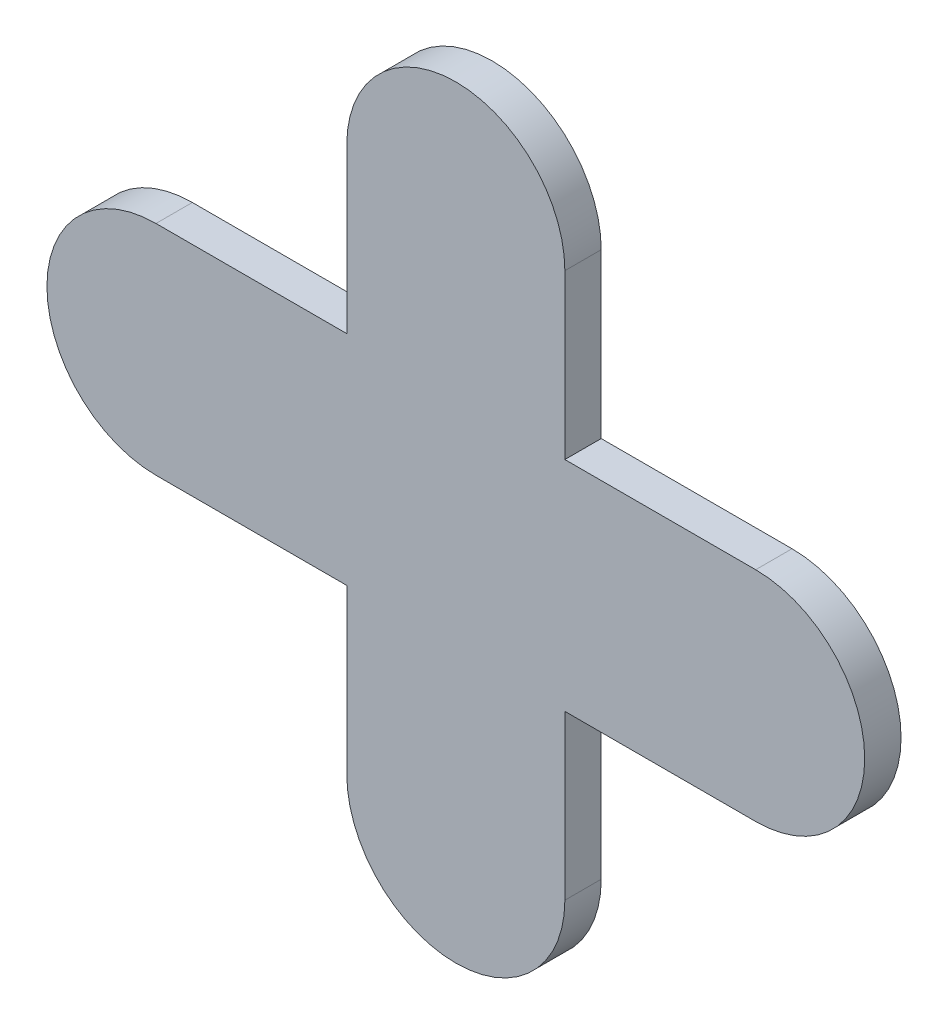
ISO-10303-21;
HEADER;
FILE_DESCRIPTION(('STEP AP214'),'2;1');
FILE_NAME('part.step','',(''),(''),'','','');
FILE_SCHEMA(('AUTOMOTIVE_DESIGN { 1 0 10303 214 1 1 1 1 }'));
ENDSEC;
DATA;
#1=APPLICATION_CONTEXT('core data for automotive mechanical design processes');
#2=APPLICATION_PROTOCOL_DEFINITION('international standard','automotive_design',2000,#1);
#3=PRODUCT_CONTEXT('',#1,'mechanical');
#4=PRODUCT('Part','Part','',(#3));
#5=PRODUCT_RELATED_PRODUCT_CATEGORY('part','',(#4));
#6=PRODUCT_DEFINITION_FORMATION('','',#4);
#7=PRODUCT_DEFINITION_CONTEXT('part definition',#1,'design');
#8=PRODUCT_DEFINITION('design','',#6,#7);
#9=PRODUCT_DEFINITION_SHAPE('','',#8);
#10=(LENGTH_UNIT() NAMED_UNIT(*) SI_UNIT(.MILLI.,.METRE.));
#11=(NAMED_UNIT(*) PLANE_ANGLE_UNIT() SI_UNIT($,.RADIAN.));
#12=(NAMED_UNIT(*) SI_UNIT($,.STERADIAN.) SOLID_ANGLE_UNIT());
#13=UNCERTAINTY_MEASURE_WITH_UNIT(LENGTH_MEASURE(1.E-05),#10,'distance_accuracy_value','');
#14=(GEOMETRIC_REPRESENTATION_CONTEXT(3) GLOBAL_UNCERTAINTY_ASSIGNED_CONTEXT((#13)) GLOBAL_UNIT_ASSIGNED_CONTEXT((#10,
#11,#12)) REPRESENTATION_CONTEXT('',''));
#15=CARTESIAN_POINT('',(0.,0.,0.));
#16=DIRECTION('',(0.,0.,1.));
#17=DIRECTION('',(1.,0.,0.));
#18=AXIS2_PLACEMENT_3D('',#15,#16,#17);
#19=CARTESIAN_POINT('',(0.,-6.,2.));
#20=DIRECTION('',(0.,1.,0.));
#21=DIRECTION('',(0.,0.,1.));
#22=AXIS2_PLACEMENT_3D('',#19,#20,#21);
#23=PLANE('',#22);
#24=DIRECTION('',(1.,0.,0.));
#25=VECTOR('',#24,1.);
#26=CARTESIAN_POINT('',(0.,-6.,0.));
#27=LINE('',#26,#25);
#28=CARTESIAN_POINT('',(6.,-6.,0.));
#29=VERTEX_POINT('',#28);
#30=CARTESIAN_POINT('',(16.5,-6.,0.));
#31=VERTEX_POINT('',#30);
#32=EDGE_CURVE('E163',#29,#31,#27,.T.);
#33=ORIENTED_EDGE('',*,*,#32,.T.);
#34=DIRECTION('',(0.,0.,-1.));
#35=VECTOR('',#34,1.);
#36=CARTESIAN_POINT('',(16.5,-6.,2.));
#37=LINE('',#36,#35);
#38=CARTESIAN_POINT('',(16.5,-6.,2.));
#39=VERTEX_POINT('',#38);
#40=EDGE_CURVE('E49',#39,#31,#37,.T.);
#41=ORIENTED_EDGE('',*,*,#40,.F.);
#42=DIRECTION('',(1.,0.,0.));
#43=VECTOR('',#42,1.);
#44=CARTESIAN_POINT('',(0.,-6.,2.));
#45=LINE('',#44,#43);
#46=CARTESIAN_POINT('',(6.,-6.,2.));
#47=VERTEX_POINT('',#46);
#48=EDGE_CURVE('E192',#47,#39,#45,.T.);
#49=ORIENTED_EDGE('',*,*,#48,.F.);
#50=DIRECTION('',(0.,0.,-1.));
#51=VECTOR('',#50,1.);
#52=CARTESIAN_POINT('',(6.,-6.,2.));
#53=LINE('',#52,#51);
#54=EDGE_CURVE('E162',#47,#29,#53,.T.);
#55=ORIENTED_EDGE('',*,*,#54,.T.);
#56=EDGE_LOOP('',(#33,#41,#49,#55));
#57=FACE_BOUND('',#56,.T.);
#58=ADVANCED_FACE('F41',(#57),#23,.F.);
#59=CARTESIAN_POINT('',(16.5,0.,2.));
#60=DIRECTION('',(0.,0.,-1.));
#61=DIRECTION('',(-1.,0.,0.));
#62=AXIS2_PLACEMENT_3D('',#59,#60,#61);
#63=CYLINDRICAL_SURFACE('',#62,6.);
#64=CARTESIAN_POINT('',(16.5,0.,0.));
#65=DIRECTION('',(0.,0.,1.));
#66=DIRECTION('',(1.,0.,0.));
#67=AXIS2_PLACEMENT_3D('',#64,#65,#66);
#68=CIRCLE('',#67,6.);
#69=CARTESIAN_POINT('',(16.5,6.,0.));
#70=VERTEX_POINT('',#69);
#71=EDGE_CURVE('E166',#31,#70,#68,.T.);
#72=ORIENTED_EDGE('',*,*,#71,.T.);
#73=DIRECTION('',(0.,0.,-1.));
#74=VECTOR('',#73,1.);
#75=CARTESIAN_POINT('',(16.5,6.,2.));
#76=LINE('',#75,#74);
#77=CARTESIAN_POINT('',(16.5,6.,2.));
#78=VERTEX_POINT('',#77);
#79=EDGE_CURVE('E210',#78,#70,#76,.T.);
#80=ORIENTED_EDGE('',*,*,#79,.F.);
#81=CARTESIAN_POINT('',(16.5,0.,2.));
#82=DIRECTION('',(0.,0.,1.));
#83=DIRECTION('',(1.,0.,0.));
#84=AXIS2_PLACEMENT_3D('',#81,#82,#83);
#85=CIRCLE('',#84,6.);
#86=EDGE_CURVE('E112',#39,#78,#85,.T.);
#87=ORIENTED_EDGE('',*,*,#86,.F.);
#88=ORIENTED_EDGE('',*,*,#40,.T.);
#89=EDGE_LOOP('',(#72,#80,#87,#88));
#90=FACE_BOUND('',#89,.T.);
#91=ADVANCED_FACE('F212',(#90),#63,.T.);
#92=CARTESIAN_POINT('',(0.,6.,2.));
#93=DIRECTION('',(0.,1.,0.));
#94=DIRECTION('',(0.,0.,1.));
#95=AXIS2_PLACEMENT_3D('',#92,#93,#94);
#96=PLANE('',#95);
#97=DIRECTION('',(1.,0.,0.));
#98=VECTOR('',#97,1.);
#99=CARTESIAN_POINT('',(0.,6.,0.));
#100=LINE('',#99,#98);
#101=CARTESIAN_POINT('',(6.,6.,0.));
#102=VERTEX_POINT('',#101);
#103=EDGE_CURVE('E170',#102,#70,#100,.T.);
#104=ORIENTED_EDGE('',*,*,#103,.F.);
#105=DIRECTION('',(0.,0.,-1.));
#106=VECTOR('',#105,1.);
#107=CARTESIAN_POINT('',(6.,6.,2.));
#108=LINE('',#107,#106);
#109=CARTESIAN_POINT('',(6.,6.,2.));
#110=VERTEX_POINT('',#109);
#111=EDGE_CURVE('E208',#110,#102,#108,.T.);
#112=ORIENTED_EDGE('',*,*,#111,.F.);
#113=DIRECTION('',(1.,0.,0.));
#114=VECTOR('',#113,1.);
#115=CARTESIAN_POINT('',(0.,6.,2.));
#116=LINE('',#115,#114);
#117=EDGE_CURVE('E226',#110,#78,#116,.T.);
#118=ORIENTED_EDGE('',*,*,#117,.T.);
#119=ORIENTED_EDGE('',*,*,#79,.T.);
#120=EDGE_LOOP('',(#104,#112,#118,#119));
#121=FACE_BOUND('',#120,.T.);
#122=ADVANCED_FACE('F222',(#121),#96,.T.);
#123=CARTESIAN_POINT('',(6.,0.,2.));
#124=DIRECTION('',(-1.,0.,0.));
#125=DIRECTION('',(0.,0.,1.));
#126=AXIS2_PLACEMENT_3D('',#123,#124,#125);
#127=PLANE('',#126);
#128=DIRECTION('',(0.,1.,0.));
#129=VECTOR('',#128,1.);
#130=CARTESIAN_POINT('',(6.,0.,0.));
#131=LINE('',#130,#129);
#132=CARTESIAN_POINT('',(6.,15.,0.));
#133=VERTEX_POINT('',#132);
#134=EDGE_CURVE('E173',#102,#133,#131,.T.);
#135=ORIENTED_EDGE('',*,*,#134,.T.);
#136=DIRECTION('',(0.,0.,-1.));
#137=VECTOR('',#136,1.);
#138=CARTESIAN_POINT('',(6.,15.,2.));
#139=LINE('',#138,#137);
#140=CARTESIAN_POINT('',(6.,15.,2.));
#141=VERTEX_POINT('',#140);
#142=EDGE_CURVE('E205',#141,#133,#139,.T.);
#143=ORIENTED_EDGE('',*,*,#142,.F.);
#144=DIRECTION('',(0.,1.,0.));
#145=VECTOR('',#144,1.);
#146=CARTESIAN_POINT('',(6.,0.,2.));
#147=LINE('',#146,#145);
#148=EDGE_CURVE('E227',#110,#141,#147,.T.);
#149=ORIENTED_EDGE('',*,*,#148,.F.);
#150=ORIENTED_EDGE('',*,*,#111,.T.);
#151=EDGE_LOOP('',(#135,#143,#149,#150));
#152=FACE_BOUND('',#151,.T.);
#153=ADVANCED_FACE('F262',(#152),#127,.F.);
#154=CARTESIAN_POINT('',(0.,15.,2.));
#155=DIRECTION('',(0.,0.,-1.));
#156=DIRECTION('',(-1.,0.,0.));
#157=AXIS2_PLACEMENT_3D('',#154,#155,#156);
#158=CYLINDRICAL_SURFACE('',#157,6.);
#159=CARTESIAN_POINT('',(0.,15.,0.));
#160=DIRECTION('',(0.,0.,1.));
#161=DIRECTION('',(1.,0.,0.));
#162=AXIS2_PLACEMENT_3D('',#159,#160,#161);
#163=CIRCLE('',#162,6.);
#164=CARTESIAN_POINT('',(-6.,15.,0.));
#165=VERTEX_POINT('',#164);
#166=EDGE_CURVE('E175',#133,#165,#163,.T.);
#167=ORIENTED_EDGE('',*,*,#166,.T.);
#168=DIRECTION('',(0.,0.,-1.));
#169=VECTOR('',#168,1.);
#170=CARTESIAN_POINT('',(-6.,15.,2.));
#171=LINE('',#170,#169);
#172=CARTESIAN_POINT('',(-6.,15.,2.));
#173=VERTEX_POINT('',#172);
#174=EDGE_CURVE('E203',#173,#165,#171,.T.);
#175=ORIENTED_EDGE('',*,*,#174,.F.);
#176=CARTESIAN_POINT('',(0.,15.,2.));
#177=DIRECTION('',(0.,0.,1.));
#178=DIRECTION('',(1.,0.,0.));
#179=AXIS2_PLACEMENT_3D('',#176,#177,#178);
#180=CIRCLE('',#179,6.);
#181=EDGE_CURVE('E229',#141,#173,#180,.T.);
#182=ORIENTED_EDGE('',*,*,#181,.F.);
#183=ORIENTED_EDGE('',*,*,#142,.T.);
#184=EDGE_LOOP('',(#167,#175,#182,#183));
#185=FACE_BOUND('',#184,.T.);
#186=ADVANCED_FACE('F258',(#185),#158,.T.);
#187=CARTESIAN_POINT('',(-6.,0.,2.));
#188=DIRECTION('',(-1.,0.,0.));
#189=DIRECTION('',(0.,0.,1.));
#190=AXIS2_PLACEMENT_3D('',#187,#188,#189);
#191=PLANE('',#190);
#192=DIRECTION('',(0.,1.,0.));
#193=VECTOR('',#192,1.);
#194=CARTESIAN_POINT('',(-6.,0.,0.));
#195=LINE('',#194,#193);
#196=CARTESIAN_POINT('',(-6.,6.,0.));
#197=VERTEX_POINT('',#196);
#198=EDGE_CURVE('E178',#197,#165,#195,.T.);
#199=ORIENTED_EDGE('',*,*,#198,.F.);
#200=DIRECTION('',(0.,0.,-1.));
#201=VECTOR('',#200,1.);
#202=CARTESIAN_POINT('',(-6.,6.,2.));
#203=LINE('',#202,#201);
#204=CARTESIAN_POINT('',(-6.,6.,2.));
#205=VERTEX_POINT('',#204);
#206=EDGE_CURVE('E201',#205,#197,#203,.T.);
#207=ORIENTED_EDGE('',*,*,#206,.F.);
#208=DIRECTION('',(0.,1.,0.));
#209=VECTOR('',#208,1.);
#210=CARTESIAN_POINT('',(-6.,0.,2.));
#211=LINE('',#210,#209);
#212=EDGE_CURVE('E235',#205,#173,#211,.T.);
#213=ORIENTED_EDGE('',*,*,#212,.T.);
#214=ORIENTED_EDGE('',*,*,#174,.T.);
#215=EDGE_LOOP('',(#199,#207,#213,#214));
#216=FACE_BOUND('',#215,.T.);
#217=ADVANCED_FACE('F255',(#216),#191,.T.);
#218=CARTESIAN_POINT('',(0.,6.,2.));
#219=DIRECTION('',(0.,1.,0.));
#220=DIRECTION('',(0.,0.,1.));
#221=AXIS2_PLACEMENT_3D('',#218,#219,#220);
#222=PLANE('',#221);
#223=DIRECTION('',(1.,0.,0.));
#224=VECTOR('',#223,1.);
#225=CARTESIAN_POINT('',(0.,6.,0.));
#226=LINE('',#225,#224);
#227=CARTESIAN_POINT('',(-16.5,6.,0.));
#228=VERTEX_POINT('',#227);
#229=EDGE_CURVE('E181',#228,#197,#226,.T.);
#230=ORIENTED_EDGE('',*,*,#229,.F.);
#231=DIRECTION('',(0.,0.,-1.));
#232=VECTOR('',#231,1.);
#233=CARTESIAN_POINT('',(-16.5,6.,2.));
#234=LINE('',#233,#232);
#235=CARTESIAN_POINT('',(-16.5,6.,2.));
#236=VERTEX_POINT('',#235);
#237=EDGE_CURVE('E199',#236,#228,#234,.T.);
#238=ORIENTED_EDGE('',*,*,#237,.F.);
#239=DIRECTION('',(1.,0.,0.));
#240=VECTOR('',#239,1.);
#241=CARTESIAN_POINT('',(0.,6.,2.));
#242=LINE('',#241,#240);
#243=EDGE_CURVE('E238',#236,#205,#242,.T.);
#244=ORIENTED_EDGE('',*,*,#243,.T.);
#245=ORIENTED_EDGE('',*,*,#206,.T.);
#246=EDGE_LOOP('',(#230,#238,#244,#245));
#247=FACE_BOUND('',#246,.T.);
#248=ADVANCED_FACE('F252',(#247),#222,.T.);
#249=CARTESIAN_POINT('',(-16.5,0.,2.));
#250=DIRECTION('',(0.,0.,-1.));
#251=DIRECTION('',(-1.,0.,0.));
#252=AXIS2_PLACEMENT_3D('',#249,#250,#251);
#253=CYLINDRICAL_SURFACE('',#252,6.);
#254=CARTESIAN_POINT('',(-16.5,0.,0.));
#255=DIRECTION('',(0.,0.,1.));
#256=DIRECTION('',(1.,0.,0.));
#257=AXIS2_PLACEMENT_3D('',#254,#255,#256);
#258=CIRCLE('',#257,6.);
#259=CARTESIAN_POINT('',(-16.5,-6.,0.));
#260=VERTEX_POINT('',#259);
#261=EDGE_CURVE('E184',#228,#260,#258,.T.);
#262=ORIENTED_EDGE('',*,*,#261,.T.);
#263=DIRECTION('',(0.,0.,-1.));
#264=VECTOR('',#263,1.);
#265=CARTESIAN_POINT('',(-16.5,-6.,2.));
#266=LINE('',#265,#264);
#267=CARTESIAN_POINT('',(-16.5,-6.,2.));
#268=VERTEX_POINT('',#267);
#269=EDGE_CURVE('E196',#268,#260,#266,.T.);
#270=ORIENTED_EDGE('',*,*,#269,.F.);
#271=CARTESIAN_POINT('',(-16.5,0.,2.));
#272=DIRECTION('',(0.,0.,1.));
#273=DIRECTION('',(1.,0.,0.));
#274=AXIS2_PLACEMENT_3D('',#271,#272,#273);
#275=CIRCLE('',#274,6.);
#276=EDGE_CURVE('E157',#236,#268,#275,.T.);
#277=ORIENTED_EDGE('',*,*,#276,.F.);
#278=ORIENTED_EDGE('',*,*,#237,.T.);
#279=EDGE_LOOP('',(#262,#270,#277,#278));
#280=FACE_BOUND('',#279,.T.);
#281=ADVANCED_FACE('F245',(#280),#253,.T.);
#282=CARTESIAN_POINT('',(0.,-6.,2.));
#283=DIRECTION('',(0.,1.,0.));
#284=DIRECTION('',(0.,0.,1.));
#285=AXIS2_PLACEMENT_3D('',#282,#283,#284);
#286=PLANE('',#285);
#287=DIRECTION('',(1.,0.,0.));
#288=VECTOR('',#287,1.);
#289=CARTESIAN_POINT('',(0.,-6.,0.));
#290=LINE('',#289,#288);
#291=CARTESIAN_POINT('',(-6.,-6.,0.));
#292=VERTEX_POINT('',#291);
#293=EDGE_CURVE('E186',#260,#292,#290,.T.);
#294=ORIENTED_EDGE('',*,*,#293,.T.);
#295=DIRECTION('',(0.,0.,-1.));
#296=VECTOR('',#295,1.);
#297=CARTESIAN_POINT('',(-6.,-6.,2.));
#298=LINE('',#297,#296);
#299=CARTESIAN_POINT('',(-6.,-6.,2.));
#300=VERTEX_POINT('',#299);
#301=EDGE_CURVE('E146',#300,#292,#298,.T.);
#302=ORIENTED_EDGE('',*,*,#301,.F.);
#303=DIRECTION('',(1.,0.,0.));
#304=VECTOR('',#303,1.);
#305=CARTESIAN_POINT('',(0.,-6.,2.));
#306=LINE('',#305,#304);
#307=EDGE_CURVE('E154',#268,#300,#306,.T.);
#308=ORIENTED_EDGE('',*,*,#307,.F.);
#309=ORIENTED_EDGE('',*,*,#269,.T.);
#310=EDGE_LOOP('',(#294,#302,#308,#309));
#311=FACE_BOUND('',#310,.T.);
#312=ADVANCED_FACE('F249',(#311),#286,.F.);
#313=CARTESIAN_POINT('',(-6.,0.,2.));
#314=DIRECTION('',(-1.,0.,0.));
#315=DIRECTION('',(0.,0.,1.));
#316=AXIS2_PLACEMENT_3D('',#313,#314,#315);
#317=PLANE('',#316);
#318=DIRECTION('',(0.,1.,0.));
#319=VECTOR('',#318,1.);
#320=CARTESIAN_POINT('',(-6.,0.,0.));
#321=LINE('',#320,#319);
#322=CARTESIAN_POINT('',(-6.,-15.,0.));
#323=VERTEX_POINT('',#322);
#324=EDGE_CURVE('E145',#323,#292,#321,.T.);
#325=ORIENTED_EDGE('',*,*,#324,.F.);
#326=DIRECTION('',(0.,0.,-1.));
#327=VECTOR('',#326,1.);
#328=CARTESIAN_POINT('',(-6.,-15.,2.));
#329=LINE('',#328,#327);
#330=CARTESIAN_POINT('',(-6.,-15.,2.));
#331=VERTEX_POINT('',#330);
#332=EDGE_CURVE('E139',#331,#323,#329,.T.);
#333=ORIENTED_EDGE('',*,*,#332,.F.);
#334=DIRECTION('',(0.,1.,0.));
#335=VECTOR('',#334,1.);
#336=CARTESIAN_POINT('',(-6.,0.,2.));
#337=LINE('',#336,#335);
#338=EDGE_CURVE('E143',#331,#300,#337,.T.);
#339=ORIENTED_EDGE('',*,*,#338,.T.);
#340=ORIENTED_EDGE('',*,*,#301,.T.);
#341=EDGE_LOOP('',(#325,#333,#339,#340));
#342=FACE_BOUND('',#341,.T.);
#343=ADVANCED_FACE('F141',(#342),#317,.T.);
#344=CARTESIAN_POINT('',(0.,-15.,2.));
#345=DIRECTION('',(0.,0.,-1.));
#346=DIRECTION('',(-1.,0.,0.));
#347=AXIS2_PLACEMENT_3D('',#344,#345,#346);
#348=CYLINDRICAL_SURFACE('',#347,6.);
#349=CARTESIAN_POINT('',(0.,-15.,0.));
#350=DIRECTION('',(0.,0.,1.));
#351=DIRECTION('',(1.,0.,0.));
#352=AXIS2_PLACEMENT_3D('',#349,#350,#351);
#353=CIRCLE('',#352,6.);
#354=CARTESIAN_POINT('',(6.,-15.,0.));
#355=VERTEX_POINT('',#354);
#356=EDGE_CURVE('E97',#323,#355,#353,.T.);
#357=ORIENTED_EDGE('',*,*,#356,.T.);
#358=DIRECTION('',(0.,0.,-1.));
#359=VECTOR('',#358,1.);
#360=CARTESIAN_POINT('',(6.,-15.,2.));
#361=LINE('',#360,#359);
#362=CARTESIAN_POINT('',(6.,-15.,2.));
#363=VERTEX_POINT('',#362);
#364=EDGE_CURVE('E147',#363,#355,#361,.T.);
#365=ORIENTED_EDGE('',*,*,#364,.F.);
#366=CARTESIAN_POINT('',(0.,-15.,2.));
#367=DIRECTION('',(0.,0.,1.));
#368=DIRECTION('',(1.,0.,0.));
#369=AXIS2_PLACEMENT_3D('',#366,#367,#368);
#370=CIRCLE('',#369,6.);
#371=EDGE_CURVE('E149',#331,#363,#370,.T.);
#372=ORIENTED_EDGE('',*,*,#371,.F.);
#373=ORIENTED_EDGE('',*,*,#332,.T.);
#374=EDGE_LOOP('',(#357,#365,#372,#373));
#375=FACE_BOUND('',#374,.T.);
#376=ADVANCED_FACE('F150',(#375),#348,.T.);
#377=CARTESIAN_POINT('',(6.,0.,2.));
#378=DIRECTION('',(-1.,0.,0.));
#379=DIRECTION('',(0.,0.,1.));
#380=AXIS2_PLACEMENT_3D('',#377,#378,#379);
#381=PLANE('',#380);
#382=DIRECTION('',(0.,1.,0.));
#383=VECTOR('',#382,1.);
#384=CARTESIAN_POINT('',(6.,0.,0.));
#385=LINE('',#384,#383);
#386=EDGE_CURVE('E103',#355,#29,#385,.T.);
#387=ORIENTED_EDGE('',*,*,#386,.T.);
#388=ORIENTED_EDGE('',*,*,#54,.F.);
#389=DIRECTION('',(0.,1.,0.));
#390=VECTOR('',#389,1.);
#391=CARTESIAN_POINT('',(6.,0.,2.));
#392=LINE('',#391,#390);
#393=EDGE_CURVE('E57',#363,#47,#392,.T.);
#394=ORIENTED_EDGE('',*,*,#393,.F.);
#395=ORIENTED_EDGE('',*,*,#364,.T.);
#396=EDGE_LOOP('',(#387,#388,#394,#395));
#397=FACE_BOUND('',#396,.T.);
#398=ADVANCED_FACE('F340',(#397),#381,.F.);
#399=CARTESIAN_POINT('',(0.,0.,2.));
#400=DIRECTION('',(0.,0.,1.));
#401=DIRECTION('',(1.,0.,0.));
#402=AXIS2_PLACEMENT_3D('',#399,#400,#401);
#403=PLANE('',#402);
#404=ORIENTED_EDGE('',*,*,#48,.T.);
#405=ORIENTED_EDGE('',*,*,#86,.T.);
#406=ORIENTED_EDGE('',*,*,#117,.F.);
#407=ORIENTED_EDGE('',*,*,#148,.T.);
#408=ORIENTED_EDGE('',*,*,#181,.T.);
#409=ORIENTED_EDGE('',*,*,#212,.F.);
#410=ORIENTED_EDGE('',*,*,#243,.F.);
#411=ORIENTED_EDGE('',*,*,#276,.T.);
#412=ORIENTED_EDGE('',*,*,#307,.T.);
#413=ORIENTED_EDGE('',*,*,#338,.F.);
#414=ORIENTED_EDGE('',*,*,#371,.T.);
#415=ORIENTED_EDGE('',*,*,#393,.T.);
#416=EDGE_LOOP('',(#404,#405,#406,#407,#408,#409,#410,#411,#412,#413,#414,#415));
#417=FACE_BOUND('',#416,.T.);
#418=ADVANCED_FACE('F152',(#417),#403,.T.);
#419=CARTESIAN_POINT('',(0.,0.,0.));
#420=DIRECTION('',(0.,0.,1.));
#421=DIRECTION('',(1.,0.,0.));
#422=AXIS2_PLACEMENT_3D('',#419,#420,#421);
#423=PLANE('',#422);
#424=CARTESIAN_POINT('',(0.,0.,0.));
#425=DIRECTION('',(0.,0.,1.));
#426=DIRECTION('',(1.,0.,0.));
#427=AXIS2_PLACEMENT_3D('',#424,#425,#426);
#428=CIRCLE('',#427,5.);
#429=CARTESIAN_POINT('',(5.,0.,0.));
#430=VERTEX_POINT('',#429);
#431=EDGE_CURVE('E11',#430,#430,#428,.F.);
#432=ORIENTED_EDGE('',*,*,#431,.F.);
#433=EDGE_LOOP('',(#432));
#434=FACE_BOUND('',#433,.T.);
#435=ORIENTED_EDGE('',*,*,#32,.F.);
#436=ORIENTED_EDGE('',*,*,#386,.F.);
#437=ORIENTED_EDGE('',*,*,#356,.F.);
#438=ORIENTED_EDGE('',*,*,#324,.T.);
#439=ORIENTED_EDGE('',*,*,#293,.F.);
#440=ORIENTED_EDGE('',*,*,#261,.F.);
#441=ORIENTED_EDGE('',*,*,#229,.T.);
#442=ORIENTED_EDGE('',*,*,#198,.T.);
#443=ORIENTED_EDGE('',*,*,#166,.F.);
#444=ORIENTED_EDGE('',*,*,#134,.F.);
#445=ORIENTED_EDGE('',*,*,#103,.T.);
#446=ORIENTED_EDGE('',*,*,#71,.F.);
#447=EDGE_LOOP('',(#435,#436,#437,#438,#439,#440,#441,#442,#443,#444,#445,#446));
#448=FACE_BOUND('',#447,.T.);
#449=ADVANCED_FACE('F217',(#434,#448),#423,.F.);
#450=CARTESIAN_POINT('',(0.,0.,-2.));
#451=DIRECTION('',(0.,0.,1.));
#452=DIRECTION('',(1.,0.,0.));
#453=AXIS2_PLACEMENT_3D('',#450,#451,#452);
#454=CYLINDRICAL_SURFACE('',#453,5.);
#455=CARTESIAN_POINT('',(0.,0.,-2.));
#456=DIRECTION('',(0.,0.,-1.));
#457=DIRECTION('',(-1.,0.,0.));
#458=AXIS2_PLACEMENT_3D('',#455,#456,#457);
#459=CIRCLE('',#458,5.);
#460=CARTESIAN_POINT('',(-5.,0.,-2.));
#461=VERTEX_POINT('',#460);
#462=EDGE_CURVE('E167',#461,#461,#459,.T.);
#463=ORIENTED_EDGE('',*,*,#462,.F.);
#464=EDGE_LOOP('',(#463));
#465=FACE_BOUND('',#464,.T.);
#466=ORIENTED_EDGE('',*,*,#431,.T.);
#467=EDGE_LOOP('',(#466));
#468=FACE_BOUND('',#467,.T.);
#469=ADVANCED_FACE('F368',(#465,#468),#454,.T.);
#470=CARTESIAN_POINT('',(0.,0.,-2.));
#471=DIRECTION('',(0.,0.,-1.));
#472=DIRECTION('',(-1.,0.,0.));
#473=AXIS2_PLACEMENT_3D('',#470,#471,#472);
#474=PLANE('',#473);
#475=CARTESIAN_POINT('',(0.,0.,-2.));
#476=DIRECTION('',(0.,0.,-1.));
#477=DIRECTION('',(-1.,0.,0.));
#478=AXIS2_PLACEMENT_3D('',#475,#476,#477);
#479=CIRCLE('',#478,2.5);
#480=CARTESIAN_POINT('',(-2.5,0.,-2.));
#481=VERTEX_POINT('',#480);
#482=EDGE_CURVE('E416',#481,#481,#479,.T.);
#483=ORIENTED_EDGE('',*,*,#482,.F.);
#484=EDGE_LOOP('',(#483));
#485=FACE_BOUND('',#484,.T.);
#486=ORIENTED_EDGE('',*,*,#462,.T.);
#487=EDGE_LOOP('',(#486));
#488=FACE_BOUND('',#487,.T.);
#489=ADVANCED_FACE('F379',(#485,#488),#474,.T.);
#490=CARTESIAN_POINT('',(0.,0.,0.));
#491=DIRECTION('',(0.,0.,-1.));
#492=DIRECTION('',(-1.,0.,0.));
#493=AXIS2_PLACEMENT_3D('',#490,#491,#492);
#494=CYLINDRICAL_SURFACE('',#493,2.5);
#495=CARTESIAN_POINT('',(0.,0.,0.));
#496=DIRECTION('',(0.,0.,-1.));
#497=DIRECTION('',(-1.,0.,0.));
#498=AXIS2_PLACEMENT_3D('',#495,#496,#497);
#499=CIRCLE('',#498,2.5);
#500=CARTESIAN_POINT('',(-2.5,0.,0.));
#501=VERTEX_POINT('',#500);
#502=EDGE_CURVE('E415',#501,#501,#499,.T.);
#503=ORIENTED_EDGE('',*,*,#502,.F.);
#504=EDGE_LOOP('',(#503));
#505=FACE_BOUND('',#504,.T.);
#506=ORIENTED_EDGE('',*,*,#482,.T.);
#507=EDGE_LOOP('',(#506));
#508=FACE_BOUND('',#507,.T.);
#509=ADVANCED_FACE('F389',(#505,#508),#494,.F.);
#510=CARTESIAN_POINT('',(0.,0.,0.));
#511=DIRECTION('',(0.,0.,-1.));
#512=DIRECTION('',(-1.,0.,0.));
#513=AXIS2_PLACEMENT_3D('',#510,#511,#512);
#514=PLANE('',#513);
#515=ORIENTED_EDGE('',*,*,#502,.T.);
#516=EDGE_LOOP('',(#515));
#517=FACE_BOUND('',#516,.T.);
#518=ADVANCED_FACE('F399',(#517),#514,.T.);
#519=CLOSED_SHELL('',(#58,#91,#122,#153,#186,#217,#248,#281,#312,#343,#376,#398,#418,#449,#469,
#489,#509,#518));
#520=MANIFOLD_SOLID_BREP('B2',#519);
#521=ADVANCED_BREP_SHAPE_REPRESENTATION('',(#18,#520),#14);
#522=SHAPE_DEFINITION_REPRESENTATION(#9,#521);
ENDSEC;
END-ISO-10303-21;
